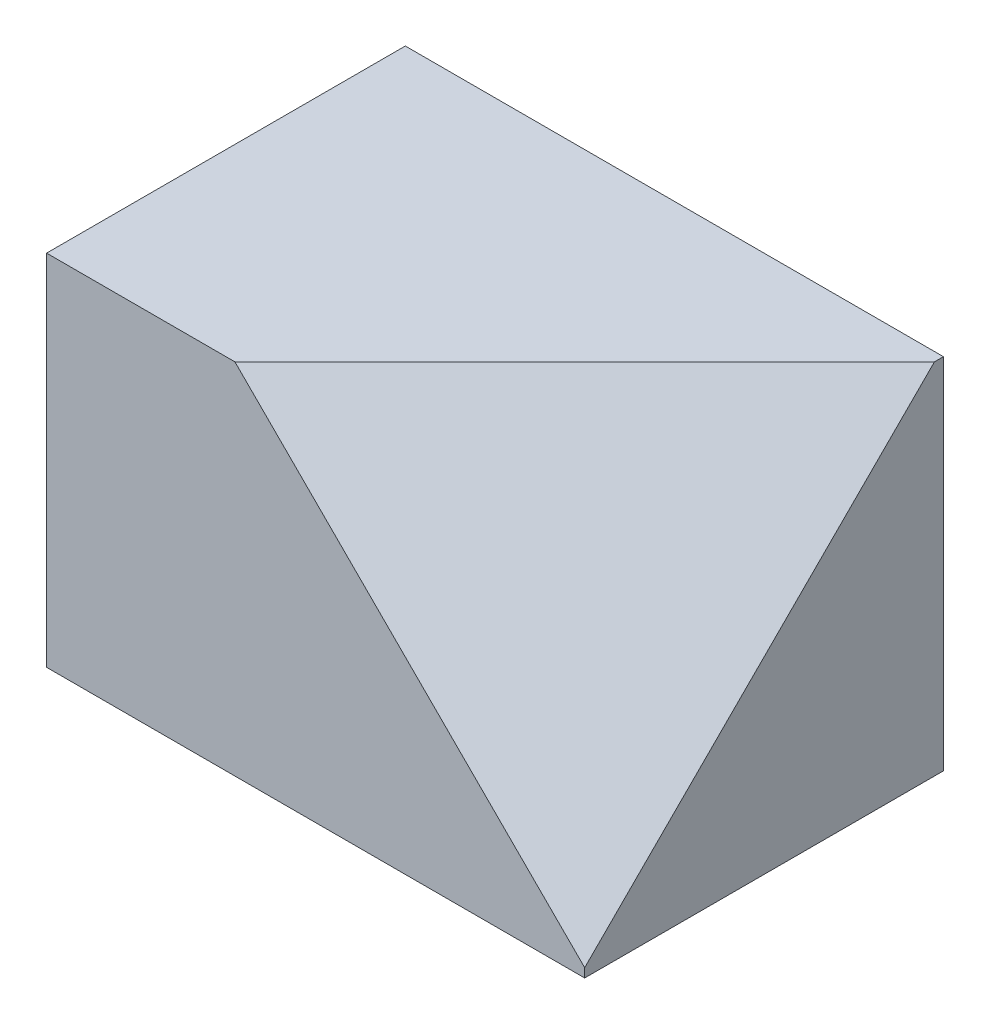
ISO-10303-21;
HEADER;
FILE_DESCRIPTION(('STEP AP214'),'2;1');
FILE_NAME('part.step','',(''),(''),'','','');
FILE_SCHEMA(('AUTOMOTIVE_DESIGN { 1 0 10303 214 1 1 1 1 }'));
ENDSEC;
DATA;
#1=APPLICATION_CONTEXT('core data for automotive mechanical design processes');
#2=APPLICATION_PROTOCOL_DEFINITION('international standard','automotive_design',2000,#1);
#3=PRODUCT_CONTEXT('',#1,'mechanical');
#4=PRODUCT('Part','Part','',(#3));
#5=PRODUCT_RELATED_PRODUCT_CATEGORY('part','',(#4));
#6=PRODUCT_DEFINITION_FORMATION('','',#4);
#7=PRODUCT_DEFINITION_CONTEXT('part definition',#1,'design');
#8=PRODUCT_DEFINITION('design','',#6,#7);
#9=PRODUCT_DEFINITION_SHAPE('','',#8);
#10=(LENGTH_UNIT() NAMED_UNIT(*) SI_UNIT(.MILLI.,.METRE.));
#11=(NAMED_UNIT(*) PLANE_ANGLE_UNIT() SI_UNIT($,.RADIAN.));
#12=(NAMED_UNIT(*) SI_UNIT($,.STERADIAN.) SOLID_ANGLE_UNIT());
#13=UNCERTAINTY_MEASURE_WITH_UNIT(LENGTH_MEASURE(1.E-05),#10,'distance_accuracy_value','');
#14=(GEOMETRIC_REPRESENTATION_CONTEXT(3) GLOBAL_UNCERTAINTY_ASSIGNED_CONTEXT((#13)) GLOBAL_UNIT_ASSIGNED_CONTEXT((#10,
#11,#12)) REPRESENTATION_CONTEXT('',''));
#15=CARTESIAN_POINT('',(0.,0.,0.));
#16=DIRECTION('',(0.,0.,1.));
#17=DIRECTION('',(1.,0.,0.));
#18=AXIS2_PLACEMENT_3D('',#15,#16,#17);
#19=CARTESIAN_POINT('',(0.,40.,0.));
#20=DIRECTION('',(0.,1.,0.));
#21=DIRECTION('',(0.,0.,1.));
#22=AXIS2_PLACEMENT_3D('',#19,#20,#21);
#23=PLANE('',#22);
#24=DIRECTION('',(1.,0.,0.));
#25=VECTOR('',#24,1.);
#26=CARTESIAN_POINT('',(-30.,40.,20.));
#27=LINE('',#26,#25);
#28=CARTESIAN_POINT('',(-30.,40.,20.));
#29=VERTEX_POINT('',#28);
#30=CARTESIAN_POINT('',(-8.99999999999999,40.,20.));
#31=VERTEX_POINT('',#30);
#32=EDGE_CURVE('E97',#29,#31,#27,.T.);
#33=ORIENTED_EDGE('',*,*,#32,.T.);
#34=DIRECTION('',(0.707106781186547,0.,-0.707106781186548));
#35=VECTOR('',#34,1.);
#36=CARTESIAN_POINT('',(5.5,40.,5.5));
#37=LINE('',#36,#35);
#38=CARTESIAN_POINT('',(30.,40.,-19.));
#39=VERTEX_POINT('',#38);
#40=EDGE_CURVE('E11',#31,#39,#37,.T.);
#41=ORIENTED_EDGE('',*,*,#40,.T.);
#42=DIRECTION('',(0.,0.,-1.));
#43=VECTOR('',#42,1.);
#44=CARTESIAN_POINT('',(30.,40.,-20.));
#45=LINE('',#44,#43);
#46=CARTESIAN_POINT('',(30.,40.,-20.));
#47=VERTEX_POINT('',#46);
#48=EDGE_CURVE('E86',#39,#47,#45,.T.);
#49=ORIENTED_EDGE('',*,*,#48,.T.);
#50=DIRECTION('',(-1.,0.,0.));
#51=VECTOR('',#50,1.);
#52=CARTESIAN_POINT('',(-30.,40.,-20.));
#53=LINE('',#52,#51);
#54=CARTESIAN_POINT('',(-30.,40.,-20.));
#55=VERTEX_POINT('',#54);
#56=EDGE_CURVE('E101',#47,#55,#53,.T.);
#57=ORIENTED_EDGE('',*,*,#56,.T.);
#58=DIRECTION('',(0.,0.,1.));
#59=VECTOR('',#58,1.);
#60=CARTESIAN_POINT('',(-30.,40.,-20.));
#61=LINE('',#60,#59);
#62=EDGE_CURVE('E62',#55,#29,#61,.T.);
#63=ORIENTED_EDGE('',*,*,#62,.T.);
#64=EDGE_LOOP('',(#33,#41,#49,#57,#63));
#65=FACE_BOUND('',#64,.T.);
#66=ADVANCED_FACE('F39',(#65),#23,.T.);
#67=CARTESIAN_POINT('',(30.,40.,-20.));
#68=DIRECTION('',(-1.,0.,0.));
#69=DIRECTION('',(0.,0.,1.));
#70=AXIS2_PLACEMENT_3D('',#67,#68,#69);
#71=PLANE('',#70);
#72=DIRECTION('',(0.,0.707106781186547,-0.707106781186548));
#73=VECTOR('',#72,1.);
#74=CARTESIAN_POINT('',(30.,40.5,-19.5));
#75=LINE('',#74,#73);
#76=CARTESIAN_POINT('',(30.,1.00000000000004,20.));
#77=VERTEX_POINT('',#76);
#78=EDGE_CURVE('E54',#77,#39,#75,.T.);
#79=ORIENTED_EDGE('',*,*,#78,.F.);
#80=DIRECTION('',(0.,-1.,0.));
#81=VECTOR('',#80,1.);
#82=CARTESIAN_POINT('',(30.,40.,20.));
#83=LINE('',#82,#81);
#84=CARTESIAN_POINT('',(30.,0.,20.));
#85=VERTEX_POINT('',#84);
#86=EDGE_CURVE('E82',#77,#85,#83,.T.);
#87=ORIENTED_EDGE('',*,*,#86,.T.);
#88=DIRECTION('',(0.,0.,-1.));
#89=VECTOR('',#88,1.);
#90=CARTESIAN_POINT('',(30.,0.,-20.));
#91=LINE('',#90,#89);
#92=CARTESIAN_POINT('',(30.,0.,-20.));
#93=VERTEX_POINT('',#92);
#94=EDGE_CURVE('E105',#85,#93,#91,.T.);
#95=ORIENTED_EDGE('',*,*,#94,.T.);
#96=DIRECTION('',(0.,-1.,0.));
#97=VECTOR('',#96,1.);
#98=CARTESIAN_POINT('',(30.,40.,-20.));
#99=LINE('',#98,#97);
#100=EDGE_CURVE('E117',#47,#93,#99,.T.);
#101=ORIENTED_EDGE('',*,*,#100,.F.);
#102=ORIENTED_EDGE('',*,*,#48,.F.);
#103=EDGE_LOOP('',(#79,#87,#95,#101,#102));
#104=FACE_BOUND('',#103,.T.);
#105=ADVANCED_FACE('F41',(#104),#71,.F.);
#106=CARTESIAN_POINT('',(-30.,40.,-20.));
#107=DIRECTION('',(0.,0.,1.));
#108=DIRECTION('',(1.,0.,0.));
#109=AXIS2_PLACEMENT_3D('',#106,#107,#108);
#110=PLANE('',#109);
#111=DIRECTION('',(-1.,0.,0.));
#112=VECTOR('',#111,1.);
#113=CARTESIAN_POINT('',(-30.,0.,-20.));
#114=LINE('',#113,#112);
#115=CARTESIAN_POINT('',(-30.,0.,-20.));
#116=VERTEX_POINT('',#115);
#117=EDGE_CURVE('E107',#93,#116,#114,.T.);
#118=ORIENTED_EDGE('',*,*,#117,.T.);
#119=DIRECTION('',(0.,-1.,0.));
#120=VECTOR('',#119,1.);
#121=CARTESIAN_POINT('',(-30.,40.,-20.));
#122=LINE('',#121,#120);
#123=EDGE_CURVE('E114',#55,#116,#122,.T.);
#124=ORIENTED_EDGE('',*,*,#123,.F.);
#125=ORIENTED_EDGE('',*,*,#56,.F.);
#126=ORIENTED_EDGE('',*,*,#100,.T.);
#127=EDGE_LOOP('',(#118,#124,#125,#126));
#128=FACE_BOUND('',#127,.T.);
#129=ADVANCED_FACE('F122',(#128),#110,.F.);
#130=CARTESIAN_POINT('',(-30.,40.,-20.));
#131=DIRECTION('',(1.,0.,0.));
#132=DIRECTION('',(0.,0.,-1.));
#133=AXIS2_PLACEMENT_3D('',#130,#131,#132);
#134=PLANE('',#133);
#135=DIRECTION('',(0.,0.,1.));
#136=VECTOR('',#135,1.);
#137=CARTESIAN_POINT('',(-30.,0.,-20.));
#138=LINE('',#137,#136);
#139=CARTESIAN_POINT('',(-30.,0.,20.));
#140=VERTEX_POINT('',#139);
#141=EDGE_CURVE('E109',#116,#140,#138,.T.);
#142=ORIENTED_EDGE('',*,*,#141,.T.);
#143=DIRECTION('',(0.,-1.,0.));
#144=VECTOR('',#143,1.);
#145=CARTESIAN_POINT('',(-30.,40.,20.));
#146=LINE('',#145,#144);
#147=EDGE_CURVE('E99',#29,#140,#146,.T.);
#148=ORIENTED_EDGE('',*,*,#147,.F.);
#149=ORIENTED_EDGE('',*,*,#62,.F.);
#150=ORIENTED_EDGE('',*,*,#123,.T.);
#151=EDGE_LOOP('',(#142,#148,#149,#150));
#152=FACE_BOUND('',#151,.T.);
#153=ADVANCED_FACE('F130',(#152),#134,.F.);
#154=CARTESIAN_POINT('',(-30.,40.,20.));
#155=DIRECTION('',(0.,0.,-1.));
#156=DIRECTION('',(-1.,0.,0.));
#157=AXIS2_PLACEMENT_3D('',#154,#155,#156);
#158=PLANE('',#157);
#159=DIRECTION('',(0.707106781186548,-0.707106781186547,0.));
#160=VECTOR('',#159,1.);
#161=CARTESIAN_POINT('',(-19.5,50.5,20.));
#162=LINE('',#161,#160);
#163=EDGE_CURVE('E47',#31,#77,#162,.T.);
#164=ORIENTED_EDGE('',*,*,#163,.F.);
#165=ORIENTED_EDGE('',*,*,#32,.F.);
#166=ORIENTED_EDGE('',*,*,#147,.T.);
#167=DIRECTION('',(1.,0.,0.));
#168=VECTOR('',#167,1.);
#169=CARTESIAN_POINT('',(-30.,0.,20.));
#170=LINE('',#169,#168);
#171=EDGE_CURVE('E111',#140,#85,#170,.T.);
#172=ORIENTED_EDGE('',*,*,#171,.T.);
#173=ORIENTED_EDGE('',*,*,#86,.F.);
#174=EDGE_LOOP('',(#164,#165,#166,#172,#173));
#175=FACE_BOUND('',#174,.T.);
#176=ADVANCED_FACE('F95',(#175),#158,.F.);
#177=CARTESIAN_POINT('',(0.,0.,0.));
#178=DIRECTION('',(0.,1.,0.));
#179=DIRECTION('',(0.,0.,1.));
#180=AXIS2_PLACEMENT_3D('',#177,#178,#179);
#181=PLANE('',#180);
#182=ORIENTED_EDGE('',*,*,#94,.F.);
#183=ORIENTED_EDGE('',*,*,#171,.F.);
#184=ORIENTED_EDGE('',*,*,#141,.F.);
#185=ORIENTED_EDGE('',*,*,#117,.F.);
#186=EDGE_LOOP('',(#182,#183,#184,#185));
#187=FACE_BOUND('',#186,.T.);
#188=ADVANCED_FACE('F127',(#187),#181,.F.);
#189=CARTESIAN_POINT('',(17.,17.,17.));
#190=DIRECTION('',(0.577350269189626,0.577350269189626,0.577350269189626));
#191=DIRECTION('',(-0.707106781186548,0.707106781186547,0.));
#192=AXIS2_PLACEMENT_3D('',#189,#190,#191);
#193=PLANE('',#192);
#194=ORIENTED_EDGE('',*,*,#163,.T.);
#195=ORIENTED_EDGE('',*,*,#78,.T.);
#196=ORIENTED_EDGE('',*,*,#40,.F.);
#197=EDGE_LOOP('',(#194,#195,#196));
#198=FACE_BOUND('',#197,.T.);
#199=ADVANCED_FACE('F92',(#198),#193,.T.);
#200=CLOSED_SHELL('',(#66,#105,#129,#153,#176,#188,#199));
#201=MANIFOLD_SOLID_BREP('B2',#200);
#202=ADVANCED_BREP_SHAPE_REPRESENTATION('',(#18,#201),#14);
#203=SHAPE_DEFINITION_REPRESENTATION(#9,#202);
ENDSEC;
END-ISO-10303-21;
